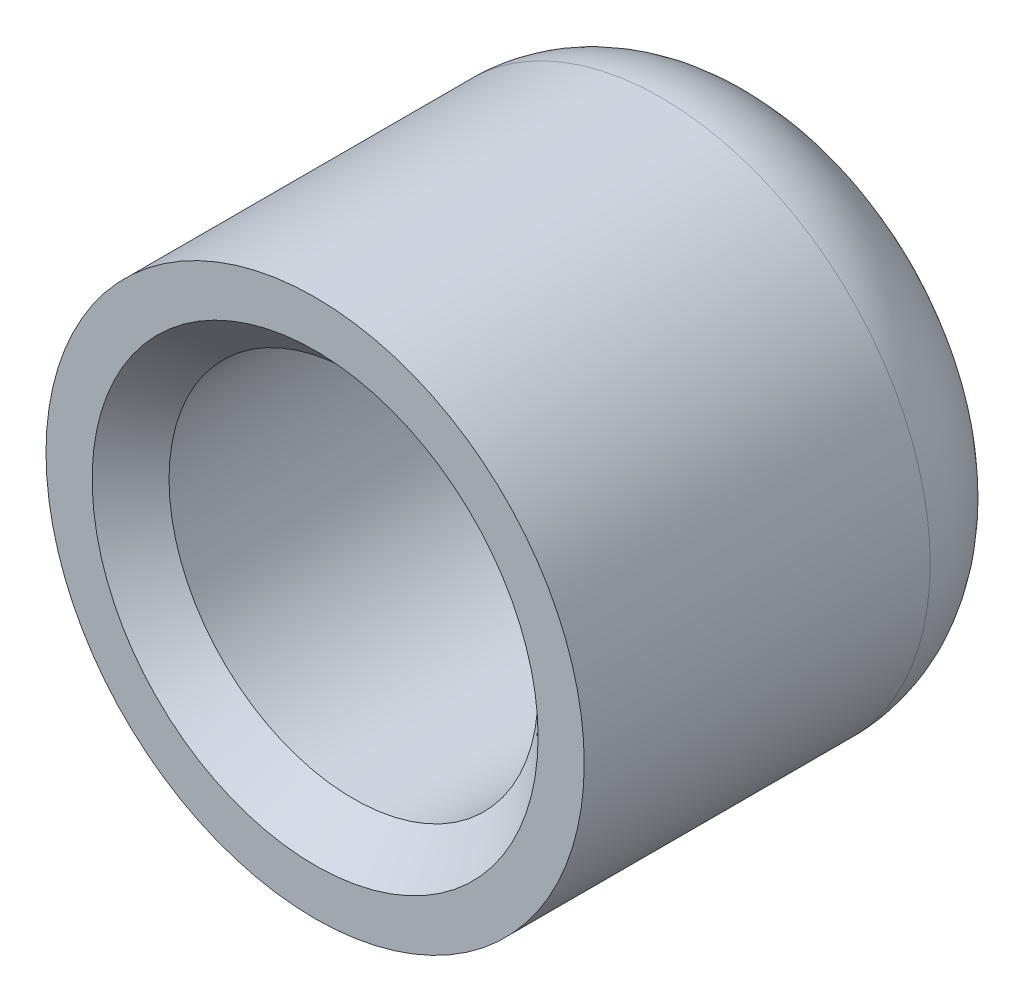
ISO-10303-21;
HEADER;
FILE_DESCRIPTION(('STEP AP214'),'2;1');
FILE_NAME('part.step','',(''),(''),'','','');
FILE_SCHEMA(('AUTOMOTIVE_DESIGN { 1 0 10303 214 1 1 1 1 }'));
ENDSEC;
DATA;
#1=APPLICATION_CONTEXT('core data for automotive mechanical design processes');
#2=APPLICATION_PROTOCOL_DEFINITION('international standard','automotive_design',2000,#1);
#3=PRODUCT_CONTEXT('',#1,'mechanical');
#4=PRODUCT('Part','Part','',(#3));
#5=PRODUCT_RELATED_PRODUCT_CATEGORY('part','',(#4));
#6=PRODUCT_DEFINITION_FORMATION('','',#4);
#7=PRODUCT_DEFINITION_CONTEXT('part definition',#1,'design');
#8=PRODUCT_DEFINITION('design','',#6,#7);
#9=PRODUCT_DEFINITION_SHAPE('','',#8);
#10=(LENGTH_UNIT() NAMED_UNIT(*) SI_UNIT(.MILLI.,.METRE.));
#11=(NAMED_UNIT(*) PLANE_ANGLE_UNIT() SI_UNIT($,.RADIAN.));
#12=(NAMED_UNIT(*) SI_UNIT($,.STERADIAN.) SOLID_ANGLE_UNIT());
#13=UNCERTAINTY_MEASURE_WITH_UNIT(LENGTH_MEASURE(1.E-05),#10,'distance_accuracy_value','');
#14=(GEOMETRIC_REPRESENTATION_CONTEXT(3) GLOBAL_UNCERTAINTY_ASSIGNED_CONTEXT((#13)) GLOBAL_UNIT_ASSIGNED_CONTEXT((#10,
#11,#12)) REPRESENTATION_CONTEXT('',''));
#15=CARTESIAN_POINT('',(0.,0.,0.));
#16=DIRECTION('',(0.,0.,1.));
#17=DIRECTION('',(1.,0.,0.));
#18=AXIS2_PLACEMENT_3D('',#15,#16,#17);
#19=CARTESIAN_POINT('',(0.,0.,6.));
#20=DIRECTION('',(0.,0.,1.));
#21=DIRECTION('',(1.,0.,0.));
#22=AXIS2_PLACEMENT_3D('',#19,#20,#21);
#23=PLANE('',#22);
#24=CARTESIAN_POINT('',(0.,0.,6.));
#25=DIRECTION('',(0.,0.,1.));
#26=DIRECTION('',(1.,0.,0.));
#27=AXIS2_PLACEMENT_3D('',#24,#25,#26);
#28=CIRCLE('',#27,2.9);
#29=CARTESIAN_POINT('',(2.9,0.,6.));
#30=VERTEX_POINT('',#29);
#31=EDGE_CURVE('E10',#30,#30,#28,.F.);
#32=ORIENTED_EDGE('',*,*,#31,.T.);
#33=EDGE_LOOP('',(#32));
#34=FACE_BOUND('',#33,.T.);
#35=CARTESIAN_POINT('',(0.,0.,6.));
#36=DIRECTION('',(0.,0.,1.));
#37=DIRECTION('',(1.,0.,0.));
#38=AXIS2_PLACEMENT_3D('',#35,#36,#37);
#39=CIRCLE('',#38,3.5);
#40=CARTESIAN_POINT('',(3.5,0.,6.));
#41=VERTEX_POINT('',#40);
#42=EDGE_CURVE('E61',#41,#41,#39,.T.);
#43=ORIENTED_EDGE('',*,*,#42,.T.);
#44=EDGE_LOOP('',(#43));
#45=FACE_BOUND('',#44,.T.);
#46=ADVANCED_FACE('F37',(#34,#45),#23,.T.);
#47=CARTESIAN_POINT('',(0.,0.,0.));
#48=DIRECTION('',(0.,0.,1.));
#49=DIRECTION('',(1.,0.,0.));
#50=AXIS2_PLACEMENT_3D('',#47,#48,#49);
#51=PLANE('',#50);
#52=CARTESIAN_POINT('',(0.,0.,0.));
#53=DIRECTION('',(0.,0.,1.));
#54=DIRECTION('',(1.,0.,0.));
#55=AXIS2_PLACEMENT_3D('',#52,#53,#54);
#56=CIRCLE('',#55,2.);
#57=CARTESIAN_POINT('',(2.,0.,0.));
#58=VERTEX_POINT('',#57);
#59=EDGE_CURVE('E49',#58,#58,#56,.F.);
#60=ORIENTED_EDGE('',*,*,#59,.T.);
#61=EDGE_LOOP('',(#60));
#62=FACE_BOUND('',#61,.T.);
#63=ADVANCED_FACE('F69',(#62),#51,.F.);
#64=CARTESIAN_POINT('',(0.,0.,6.));
#65=DIRECTION('',(0.,0.,-1.));
#66=DIRECTION('',(-1.,0.,0.));
#67=AXIS2_PLACEMENT_3D('',#64,#65,#66);
#68=CYLINDRICAL_SURFACE('',#67,3.5);
#69=CARTESIAN_POINT('',(0.,0.,1.5));
#70=DIRECTION('',(0.,0.,1.));
#71=DIRECTION('',(1.,0.,0.));
#72=AXIS2_PLACEMENT_3D('',#69,#70,#71);
#73=CIRCLE('',#72,3.5);
#74=CARTESIAN_POINT('',(3.5,0.,1.5));
#75=VERTEX_POINT('',#74);
#76=EDGE_CURVE('E53',#75,#75,#73,.T.);
#77=ORIENTED_EDGE('',*,*,#76,.T.);
#78=EDGE_LOOP('',(#77));
#79=FACE_BOUND('',#78,.T.);
#80=ORIENTED_EDGE('',*,*,#42,.F.);
#81=EDGE_LOOP('',(#80));
#82=FACE_BOUND('',#81,.T.);
#83=ADVANCED_FACE('F66',(#79,#82),#68,.T.);
#84=CARTESIAN_POINT('',(0.,0.,6.));
#85=DIRECTION('',(0.,0.,-1.));
#86=DIRECTION('',(-1.,0.,0.));
#87=AXIS2_PLACEMENT_3D('',#84,#85,#86);
#88=CYLINDRICAL_SURFACE('',#87,2.4);
#89=CARTESIAN_POINT('',(0.,0.,5.5));
#90=DIRECTION('',(0.,0.,1.));
#91=DIRECTION('',(1.,0.,0.));
#92=AXIS2_PLACEMENT_3D('',#89,#90,#91);
#93=CIRCLE('',#92,2.4);
#94=CARTESIAN_POINT('',(2.4,0.,5.5));
#95=VERTEX_POINT('',#94);
#96=EDGE_CURVE('E45',#95,#95,#93,.T.);
#97=ORIENTED_EDGE('',*,*,#96,.T.);
#98=EDGE_LOOP('',(#97));
#99=FACE_BOUND('',#98,.T.);
#100=CARTESIAN_POINT('',(0.,0.,1.));
#101=DIRECTION('',(0.,0.,1.));
#102=DIRECTION('',(1.,0.,0.));
#103=AXIS2_PLACEMENT_3D('',#100,#101,#102);
#104=CIRCLE('',#103,2.4);
#105=CARTESIAN_POINT('',(2.4,0.,1.));
#106=VERTEX_POINT('',#105);
#107=EDGE_CURVE('E58',#106,#106,#104,.T.);
#108=ORIENTED_EDGE('',*,*,#107,.F.);
#109=EDGE_LOOP('',(#108));
#110=FACE_BOUND('',#109,.T.);
#111=ADVANCED_FACE('F68',(#99,#110),#88,.F.);
#112=CARTESIAN_POINT('',(0.,0.,1.));
#113=DIRECTION('',(0.,0.,1.));
#114=DIRECTION('',(1.,0.,0.));
#115=AXIS2_PLACEMENT_3D('',#112,#113,#114);
#116=PLANE('',#115);
#117=ORIENTED_EDGE('',*,*,#107,.T.);
#118=EDGE_LOOP('',(#117));
#119=FACE_BOUND('',#118,.T.);
#120=ADVANCED_FACE('F76',(#119),#116,.T.);
#121=CARTESIAN_POINT('',(0.,0.,1.5));
#122=DIRECTION('',(0.,0.,1.));
#123=DIRECTION('',(1.,0.,0.));
#124=AXIS2_PLACEMENT_3D('',#121,#122,#123);
#125=TOROIDAL_SURFACE('',#124,2.,1.5);
#126=ORIENTED_EDGE('',*,*,#59,.F.);
#127=EDGE_LOOP('',(#126));
#128=FACE_BOUND('',#127,.T.);
#129=ORIENTED_EDGE('',*,*,#76,.F.);
#130=EDGE_LOOP('',(#129));
#131=FACE_BOUND('',#130,.T.);
#132=ADVANCED_FACE('F86',(#128,#131),#125,.T.);
#133=CARTESIAN_POINT('',(0.,0.,5.5));
#134=DIRECTION('',(0.,0.,1.));
#135=DIRECTION('',(1.,0.,0.));
#136=AXIS2_PLACEMENT_3D('',#133,#134,#135);
#137=CONICAL_SURFACE('',#136,2.4,0.78539816339745);
#138=ORIENTED_EDGE('',*,*,#31,.F.);
#139=EDGE_LOOP('',(#138));
#140=FACE_BOUND('',#139,.T.);
#141=ORIENTED_EDGE('',*,*,#96,.F.);
#142=EDGE_LOOP('',(#141));
#143=FACE_BOUND('',#142,.T.);
#144=ADVANCED_FACE('F40',(#140,#143),#137,.F.);
#145=CLOSED_SHELL('',(#46,#63,#83,#111,#120,#132,#144));
#146=MANIFOLD_SOLID_BREP('B2',#145);
#147=ADVANCED_BREP_SHAPE_REPRESENTATION('',(#18,#146),#14);
#148=SHAPE_DEFINITION_REPRESENTATION(#9,#147);
ENDSEC;
END-ISO-10303-21;
